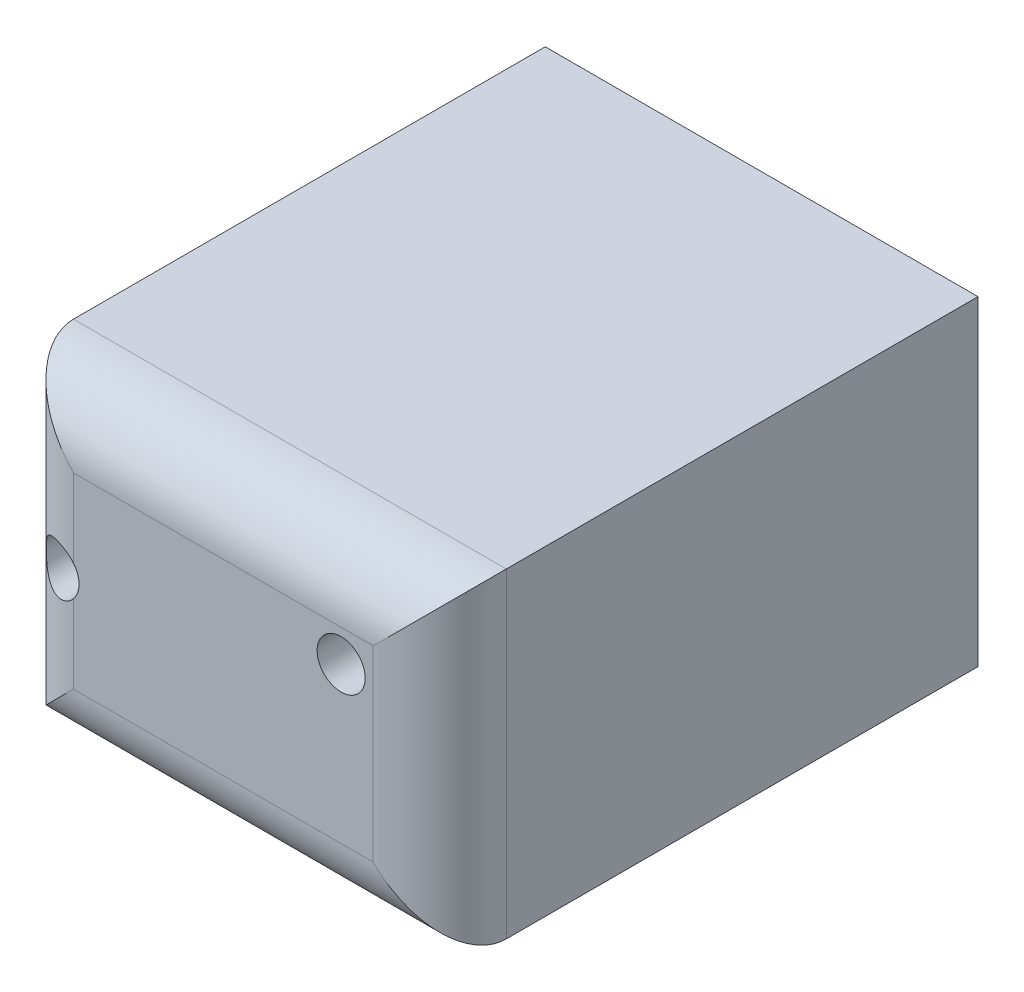
ISO-10303-21;
HEADER;
FILE_DESCRIPTION(('STEP AP214'),'2;1');
FILE_NAME('part.step','',(''),(''),'','','');
FILE_SCHEMA(('AUTOMOTIVE_DESIGN { 1 0 10303 214 1 1 1 1 }'));
ENDSEC;
DATA;
#1=APPLICATION_CONTEXT('core data for automotive mechanical design processes');
#2=APPLICATION_PROTOCOL_DEFINITION('international standard','automotive_design',2000,#1);
#3=PRODUCT_CONTEXT('',#1,'mechanical');
#4=PRODUCT('Part','Part','',(#3));
#5=PRODUCT_RELATED_PRODUCT_CATEGORY('part','',(#4));
#6=PRODUCT_DEFINITION_FORMATION('','',#4);
#7=PRODUCT_DEFINITION_CONTEXT('part definition',#1,'design');
#8=PRODUCT_DEFINITION('design','',#6,#7);
#9=PRODUCT_DEFINITION_SHAPE('','',#8);
#10=(LENGTH_UNIT() NAMED_UNIT(*) SI_UNIT(.MILLI.,.METRE.));
#11=(NAMED_UNIT(*) PLANE_ANGLE_UNIT() SI_UNIT($,.RADIAN.));
#12=(NAMED_UNIT(*) SI_UNIT($,.STERADIAN.) SOLID_ANGLE_UNIT());
#13=UNCERTAINTY_MEASURE_WITH_UNIT(LENGTH_MEASURE(1.E-05),#10,'distance_accuracy_value','');
#14=(GEOMETRIC_REPRESENTATION_CONTEXT(3) GLOBAL_UNCERTAINTY_ASSIGNED_CONTEXT((#13)) GLOBAL_UNIT_ASSIGNED_CONTEXT((#10,
#11,#12)) REPRESENTATION_CONTEXT('',''));
#15=CARTESIAN_POINT('',(0.,0.,0.));
#16=DIRECTION('',(0.,0.,1.));
#17=DIRECTION('',(1.,0.,0.));
#18=AXIS2_PLACEMENT_3D('',#15,#16,#17);
#19=CARTESIAN_POINT('',(-67.5347222222222,-50.,168.));
#20=DIRECTION('',(1.,0.,0.));
#21=DIRECTION('',(0.,1.,0.));
#22=AXIS2_PLACEMENT_3D('',#19,#20,#21);
#23=PLANE('',#22);
#24=DIRECTION('',(0.,-1.,0.));
#25=VECTOR('',#24,1.);
#26=CARTESIAN_POINT('',(-67.5347222222222,-50.,0.));
#27=LINE('',#26,#25);
#28=CARTESIAN_POINT('',(-67.5347222222222,50.,0.));
#29=VERTEX_POINT('',#28);
#30=CARTESIAN_POINT('',(-67.5347222222222,-50.,0.));
#31=VERTEX_POINT('',#30);
#32=EDGE_CURVE('E136',#29,#31,#27,.T.);
#33=ORIENTED_EDGE('',*,*,#32,.T.);
#34=DIRECTION('',(0.,0.,-1.));
#35=VECTOR('',#34,1.);
#36=CARTESIAN_POINT('',(-67.5347222222222,-50.,168.));
#37=LINE('',#36,#35);
#38=CARTESIAN_POINT('',(-67.5347222222222,-50.,147.230769230769));
#39=VERTEX_POINT('',#38);
#40=EDGE_CURVE('E152',#39,#31,#37,.T.);
#41=ORIENTED_EDGE('',*,*,#40,.F.);
#42=DIRECTION('',(0.,-1.,0.));
#43=VECTOR('',#42,1.);
#44=CARTESIAN_POINT('',(-67.5347222222222,50.0000000000001,147.230769230769));
#45=LINE('',#44,#43);
#46=CARTESIAN_POINT('',(-67.5347222222222,50.0000000000001,147.230769230769));
#47=VERTEX_POINT('',#46);
#48=EDGE_CURVE('E113',#47,#39,#45,.T.);
#49=ORIENTED_EDGE('',*,*,#48,.F.);
#50=DIRECTION('',(0.,0.,-1.));
#51=VECTOR('',#50,1.);
#52=CARTESIAN_POINT('',(-67.5347222222222,50.,168.));
#53=LINE('',#52,#51);
#54=EDGE_CURVE('E58',#47,#29,#53,.T.);
#55=ORIENTED_EDGE('',*,*,#54,.T.);
#56=EDGE_LOOP('',(#33,#41,#49,#55));
#57=FACE_BOUND('',#56,.T.);
#58=ADVANCED_FACE('F33',(#57),#23,.F.);
#59=CARTESIAN_POINT('',(0.,0.,168.));
#60=DIRECTION('',(0.,0.,1.));
#61=DIRECTION('',(1.,0.,0.));
#62=AXIS2_PLACEMENT_3D('',#59,#60,#61);
#63=PLANE('',#62);
#64=CARTESIAN_POINT('',(36.7654914529914,19.2307692307692,168.));
#65=DIRECTION('',(0.,0.,1.));
#66=DIRECTION('',(1.,0.,0.));
#67=AXIS2_PLACEMENT_3D('',#64,#65,#66);
#68=CIRCLE('',#67,7.5);
#69=CARTESIAN_POINT('',(44.2654914529914,19.2307692307692,168.));
#70=VERTEX_POINT('',#69);
#71=EDGE_CURVE('E329',#70,#70,#68,.T.);
#72=ORIENTED_EDGE('',*,*,#71,.F.);
#73=EDGE_LOOP('',(#72));
#74=FACE_BOUND('',#73,.T.);
#75=CARTESIAN_POINT('',(-52.5347222222223,-2.78530457965901E-12,168.));
#76=DIRECTION('',(0.,0.,1.));
#77=DIRECTION('',(1.,0.,0.));
#78=AXIS2_PLACEMENT_3D('',#75,#76,#77);
#79=CIRCLE('',#78,7.5);
#80=CARTESIAN_POINT('',(-46.7654914529914,-4.79228299784,168.));
#81=VERTEX_POINT('',#80);
#82=CARTESIAN_POINT('',(-46.7654914529914,4.79228299783441,168.));
#83=VERTEX_POINT('',#82);
#84=EDGE_CURVE('E50',#81,#83,#79,.T.);
#85=ORIENTED_EDGE('',*,*,#84,.F.);
#86=DIRECTION('',(0.,-1.,0.));
#87=VECTOR('',#86,1.);
#88=CARTESIAN_POINT('',(-46.7654914529914,50.,168.));
#89=LINE('',#88,#87);
#90=CARTESIAN_POINT('',(-46.7654914529914,-29.2307692307692,168.));
#91=VERTEX_POINT('',#90);
#92=EDGE_CURVE('E101',#81,#91,#89,.T.);
#93=ORIENTED_EDGE('',*,*,#92,.T.);
#94=DIRECTION('',(1.,0.,0.));
#95=VECTOR('',#94,1.);
#96=CARTESIAN_POINT('',(-67.5347222222222,-29.2307692307692,168.));
#97=LINE('',#96,#95);
#98=CARTESIAN_POINT('',(46.7654914529914,-29.2307692307692,168.));
#99=VERTEX_POINT('',#98);
#100=EDGE_CURVE('E123',#91,#99,#97,.T.);
#101=ORIENTED_EDGE('',*,*,#100,.T.);
#102=DIRECTION('',(0.,-1.,0.));
#103=VECTOR('',#102,1.);
#104=CARTESIAN_POINT('',(46.7654914529914,50.,168.));
#105=LINE('',#104,#103);
#106=CARTESIAN_POINT('',(46.7654914529914,29.2307692307692,168.));
#107=VERTEX_POINT('',#106);
#108=EDGE_CURVE('E127',#107,#99,#105,.T.);
#109=ORIENTED_EDGE('',*,*,#108,.F.);
#110=DIRECTION('',(1.,0.,0.));
#111=VECTOR('',#110,1.);
#112=CARTESIAN_POINT('',(-67.5347222222222,29.2307692307692,168.));
#113=LINE('',#112,#111);
#114=CARTESIAN_POINT('',(-46.7654914529914,29.2307692307692,168.));
#115=VERTEX_POINT('',#114);
#116=EDGE_CURVE('E130',#115,#107,#113,.T.);
#117=ORIENTED_EDGE('',*,*,#116,.F.);
#118=EDGE_CURVE('E104',#115,#83,#89,.T.);
#119=ORIENTED_EDGE('',*,*,#118,.T.);
#120=EDGE_LOOP('',(#85,#93,#101,#109,#117,#119));
#121=FACE_BOUND('',#120,.T.);
#122=ADVANCED_FACE('F100',(#74,#121),#63,.T.);
#123=CARTESIAN_POINT('',(-67.5347222222222,29.2307692307692,147.230769230769));
#124=DIRECTION('',(1.,0.,0.));
#125=DIRECTION('',(0.,0.,-1.));
#126=AXIS2_PLACEMENT_3D('',#123,#124,#125);
#127=CYLINDRICAL_SURFACE('',#126,20.7692307692308);
#128=DIRECTION('',(1.,0.,0.));
#129=VECTOR('',#128,1.);
#130=CARTESIAN_POINT('',(-67.5347222222222,50.,147.230769230769));
#131=LINE('',#130,#129);
#132=CARTESIAN_POINT('',(67.5347222222222,50.,147.230769230769));
#133=VERTEX_POINT('',#132);
#134=EDGE_CURVE('E133',#47,#133,#131,.T.);
#135=ORIENTED_EDGE('',*,*,#134,.F.);
#136=CARTESIAN_POINT('',(-46.7654914529914,29.2307692307692,147.230769230769));
#137=DIRECTION('',(0.707106781186548,0.707106781186547,0.));
#138=DIRECTION('',(0.707106781186547,-0.707106781186548,0.));
#139=AXIS2_PLACEMENT_3D('',#136,#137,#138);
#140=ELLIPSE('',#139,29.3721278339027,20.7692307692308);
#141=EDGE_CURVE('E119',#47,#115,#140,.T.);
#142=ORIENTED_EDGE('',*,*,#141,.T.);
#143=ORIENTED_EDGE('',*,*,#116,.T.);
#144=CARTESIAN_POINT('',(46.7654914529914,29.2307692307692,147.230769230769));
#145=DIRECTION('',(0.707106781186548,-0.707106781186547,0.));
#146=DIRECTION('',(0.707106781186547,0.707106781186548,0.));
#147=AXIS2_PLACEMENT_3D('',#144,#145,#146);
#148=ELLIPSE('',#147,29.3721278339027,20.7692307692308);
#149=EDGE_CURVE('E154',#133,#107,#148,.T.);
#150=ORIENTED_EDGE('',*,*,#149,.F.);
#151=EDGE_LOOP('',(#135,#142,#143,#150));
#152=FACE_BOUND('',#151,.T.);
#153=ADVANCED_FACE('F183',(#152),#127,.T.);
#154=CARTESIAN_POINT('',(-67.5347222222222,-29.2307692307692,147.230769230769));
#155=DIRECTION('',(1.,0.,0.));
#156=DIRECTION('',(0.,0.,-1.));
#157=AXIS2_PLACEMENT_3D('',#154,#155,#156);
#158=CYLINDRICAL_SURFACE('',#157,20.7692307692308);
#159=CARTESIAN_POINT('',(-46.7654914529914,-29.2307692307692,147.230769230769));
#160=DIRECTION('',(0.707106781186547,-0.707106781186548,0.));
#161=DIRECTION('',(0.707106781186548,0.707106781186547,0.));
#162=AXIS2_PLACEMENT_3D('',#159,#160,#161);
#163=ELLIPSE('',#162,29.3721278339027,20.7692307692308);
#164=EDGE_CURVE('E45',#39,#91,#163,.F.);
#165=ORIENTED_EDGE('',*,*,#164,.F.);
#166=DIRECTION('',(1.,0.,0.));
#167=VECTOR('',#166,1.);
#168=CARTESIAN_POINT('',(-67.5347222222222,-50.,147.230769230769));
#169=LINE('',#168,#167);
#170=CARTESIAN_POINT('',(67.5347222222222,-50.,147.230769230769));
#171=VERTEX_POINT('',#170);
#172=EDGE_CURVE('E122',#39,#171,#169,.T.);
#173=ORIENTED_EDGE('',*,*,#172,.T.);
#174=CARTESIAN_POINT('',(46.7654914529914,-29.2307692307692,147.230769230769));
#175=DIRECTION('',(-0.707106781186547,-0.707106781186548,0.));
#176=DIRECTION('',(0.707106781186548,-0.707106781186547,0.));
#177=AXIS2_PLACEMENT_3D('',#174,#175,#176);
#178=ELLIPSE('',#177,29.3721278339027,20.7692307692308);
#179=EDGE_CURVE('E157',#99,#171,#178,.F.);
#180=ORIENTED_EDGE('',*,*,#179,.F.);
#181=ORIENTED_EDGE('',*,*,#100,.F.);
#182=EDGE_LOOP('',(#165,#173,#180,#181));
#183=FACE_BOUND('',#182,.T.);
#184=ADVANCED_FACE('F184',(#183),#158,.T.);
#185=CARTESIAN_POINT('',(67.5347222222222,-50.,168.));
#186=DIRECTION('',(-1.,0.,0.));
#187=DIRECTION('',(0.,0.,1.));
#188=AXIS2_PLACEMENT_3D('',#185,#186,#187);
#189=PLANE('',#188);
#190=DIRECTION('',(0.,1.,0.));
#191=VECTOR('',#190,1.);
#192=CARTESIAN_POINT('',(67.5347222222222,-50.,0.));
#193=LINE('',#192,#191);
#194=CARTESIAN_POINT('',(67.5347222222222,-50.,0.));
#195=VERTEX_POINT('',#194);
#196=CARTESIAN_POINT('',(67.5347222222222,50.,0.));
#197=VERTEX_POINT('',#196);
#198=EDGE_CURVE('E142',#195,#197,#193,.T.);
#199=ORIENTED_EDGE('',*,*,#198,.T.);
#200=DIRECTION('',(0.,0.,-1.));
#201=VECTOR('',#200,1.);
#202=CARTESIAN_POINT('',(67.5347222222222,50.,168.));
#203=LINE('',#202,#201);
#204=EDGE_CURVE('E148',#133,#197,#203,.T.);
#205=ORIENTED_EDGE('',*,*,#204,.F.);
#206=DIRECTION('',(0.,-1.,0.));
#207=VECTOR('',#206,1.);
#208=CARTESIAN_POINT('',(67.5347222222222,50.,147.230769230769));
#209=LINE('',#208,#207);
#210=EDGE_CURVE('E125',#133,#171,#209,.T.);
#211=ORIENTED_EDGE('',*,*,#210,.T.);
#212=DIRECTION('',(0.,0.,-1.));
#213=VECTOR('',#212,1.);
#214=CARTESIAN_POINT('',(67.5347222222222,-50.,168.));
#215=LINE('',#214,#213);
#216=EDGE_CURVE('E150',#171,#195,#215,.T.);
#217=ORIENTED_EDGE('',*,*,#216,.T.);
#218=EDGE_LOOP('',(#199,#205,#211,#217));
#219=FACE_BOUND('',#218,.T.);
#220=ADVANCED_FACE('F168',(#219),#189,.F.);
#221=CARTESIAN_POINT('',(67.5347222222222,-50.,168.));
#222=DIRECTION('',(0.,1.,0.));
#223=DIRECTION('',(-1.,0.,0.));
#224=AXIS2_PLACEMENT_3D('',#221,#222,#223);
#225=PLANE('',#224);
#226=ORIENTED_EDGE('',*,*,#216,.F.);
#227=ORIENTED_EDGE('',*,*,#172,.F.);
#228=ORIENTED_EDGE('',*,*,#40,.T.);
#229=DIRECTION('',(1.,0.,0.));
#230=VECTOR('',#229,1.);
#231=CARTESIAN_POINT('',(67.5347222222222,-50.,0.));
#232=LINE('',#231,#230);
#233=EDGE_CURVE('E139',#31,#195,#232,.T.);
#234=ORIENTED_EDGE('',*,*,#233,.T.);
#235=EDGE_LOOP('',(#226,#227,#228,#234));
#236=FACE_BOUND('',#235,.T.);
#237=ADVANCED_FACE('F171',(#236),#225,.F.);
#238=CARTESIAN_POINT('',(67.5347222222222,50.,168.));
#239=DIRECTION('',(0.,-1.,0.));
#240=DIRECTION('',(0.,0.,-1.));
#241=AXIS2_PLACEMENT_3D('',#238,#239,#240);
#242=PLANE('',#241);
#243=ORIENTED_EDGE('',*,*,#54,.F.);
#244=ORIENTED_EDGE('',*,*,#134,.T.);
#245=ORIENTED_EDGE('',*,*,#204,.T.);
#246=DIRECTION('',(-1.,0.,0.));
#247=VECTOR('',#246,1.);
#248=CARTESIAN_POINT('',(67.5347222222222,50.,0.));
#249=LINE('',#248,#247);
#250=EDGE_CURVE('E145',#197,#29,#249,.T.);
#251=ORIENTED_EDGE('',*,*,#250,.T.);
#252=EDGE_LOOP('',(#243,#244,#245,#251));
#253=FACE_BOUND('',#252,.T.);
#254=ADVANCED_FACE('F180',(#253),#242,.F.);
#255=CARTESIAN_POINT('',(0.,0.,0.));
#256=DIRECTION('',(0.,0.,1.));
#257=DIRECTION('',(1.,0.,0.));
#258=AXIS2_PLACEMENT_3D('',#255,#256,#257);
#259=PLANE('',#258);
#260=CARTESIAN_POINT('',(36.7654914529914,19.2307692307692,0.));
#261=DIRECTION('',(0.,0.,1.));
#262=DIRECTION('',(1.,0.,0.));
#263=AXIS2_PLACEMENT_3D('',#260,#261,#262);
#264=CIRCLE('',#263,4.49999999999996);
#265=CARTESIAN_POINT('',(41.2654914529914,19.2307692307692,0.));
#266=VERTEX_POINT('',#265);
#267=EDGE_CURVE('E106',#266,#266,#264,.T.);
#268=ORIENTED_EDGE('',*,*,#267,.T.);
#269=EDGE_LOOP('',(#268));
#270=FACE_BOUND('',#269,.T.);
#271=CARTESIAN_POINT('',(-52.5347222222223,-2.78530457965901E-12,0.));
#272=DIRECTION('',(0.,0.,1.));
#273=DIRECTION('',(1.,0.,0.));
#274=AXIS2_PLACEMENT_3D('',#271,#272,#273);
#275=CIRCLE('',#274,4.49999999999996);
#276=CARTESIAN_POINT('',(-48.0347222222224,-2.78530457965901E-12,0.));
#277=VERTEX_POINT('',#276);
#278=EDGE_CURVE('E111',#277,#277,#275,.T.);
#279=ORIENTED_EDGE('',*,*,#278,.T.);
#280=EDGE_LOOP('',(#279));
#281=FACE_BOUND('',#280,.T.);
#282=ORIENTED_EDGE('',*,*,#32,.F.);
#283=ORIENTED_EDGE('',*,*,#250,.F.);
#284=ORIENTED_EDGE('',*,*,#198,.F.);
#285=ORIENTED_EDGE('',*,*,#233,.F.);
#286=EDGE_LOOP('',(#282,#283,#284,#285));
#287=FACE_BOUND('',#286,.T.);
#288=ADVANCED_FACE('F178',(#270,#281,#287),#259,.F.);
#289=CARTESIAN_POINT('',(46.7654914529914,50.,147.230769230769));
#290=DIRECTION('',(0.,-1.,0.));
#291=DIRECTION('',(1.,0.,0.));
#292=AXIS2_PLACEMENT_3D('',#289,#290,#291);
#293=CYLINDRICAL_SURFACE('',#292,20.7692307692308);
#294=ORIENTED_EDGE('',*,*,#108,.T.);
#295=ORIENTED_EDGE('',*,*,#179,.T.);
#296=ORIENTED_EDGE('',*,*,#210,.F.);
#297=ORIENTED_EDGE('',*,*,#149,.T.);
#298=EDGE_LOOP('',(#294,#295,#296,#297));
#299=FACE_BOUND('',#298,.T.);
#300=ADVANCED_FACE('F161',(#299),#293,.T.);
#301=CARTESIAN_POINT('',(-46.7654914529914,50.,147.230769230769));
#302=DIRECTION('',(0.,-1.,0.));
#303=DIRECTION('',(1.,0.,0.));
#304=AXIS2_PLACEMENT_3D('',#301,#302,#303);
#305=CYLINDRICAL_SURFACE('',#304,20.7692307692308);
#306=CARTESIAN_POINT('',(-46.7654914529914,4.7922829978344,168.));
#307=CARTESIAN_POINT('',(-46.8960808889132,4.94953159799905,168.00000315268));
#308=CARTESIAN_POINT('',(-47.0331393274406,5.10141713270744,167.998768861195));
#309=CARTESIAN_POINT('',(-47.3191690824698,5.39348616359764,167.99311045447));
#310=CARTESIAN_POINT('',(-47.4681415643609,5.53366851226771,167.988686026841));
#311=CARTESIAN_POINT('',(-47.7769104654192,5.80129128799375,167.97593369407));
#312=CARTESIAN_POINT('',(-47.9367042238686,5.92873482830274,167.967606745514));
#313=CARTESIAN_POINT('',(-48.2659495222436,6.17002637741221,167.946385948705));
#314=CARTESIAN_POINT('',(-48.4354004778457,6.283875207494,167.933492376518));
#315=CARTESIAN_POINT('',(-48.7829181773917,6.49735415144674,167.902523025496));
#316=CARTESIAN_POINT('',(-48.960996726623,6.59696400146326,167.884439969233));
#317=CARTESIAN_POINT('',(-49.3241413488758,6.78112207585621,167.842602192244));
#318=CARTESIAN_POINT('',(-49.5092074527479,6.86567023372502,167.818847446474));
#319=CARTESIAN_POINT('',(-49.8847052375885,7.01915383169213,167.765310597834));
#320=CARTESIAN_POINT('',(-50.0751330692885,7.08810016665296,167.735532728643));
#321=CARTESIAN_POINT('',(-50.4599398692726,7.21013311744659,167.669705001504));
#322=CARTESIAN_POINT('',(-50.6543187675105,7.26322001418156,167.633655254661));
#323=CARTESIAN_POINT('',(-51.0426554936224,7.35274568052284,167.555765307823));
#324=CARTESIAN_POINT('',(-51.2365788300632,7.38941389918455,167.514016292821));
#325=CARTESIAN_POINT('',(-51.6253807792816,7.44726398732745,167.424387916302));
#326=CARTESIAN_POINT('',(-51.8202596911378,7.46844064927394,167.376506499709));
#327=CARTESIAN_POINT('',(-52.2095366818422,7.49548704032459,167.274815523922));
#328=CARTESIAN_POINT('',(-52.4039347307422,7.5013558388992,167.221005604556));
#329=CARTESIAN_POINT('',(-52.7910266834867,7.49811900185965,167.107754886502));
#330=CARTESIAN_POINT('',(-52.9837199105684,7.48900766608244,167.04831195248));
#331=CARTESIAN_POINT('',(-53.3728574572689,7.45566810609546,166.922060495688));
#332=CARTESIAN_POINT('',(-53.569197282712,7.43092234910095,166.855067082798));
#333=CARTESIAN_POINT('',(-53.9576520843938,7.36641393331767,166.716054718324));
#334=CARTESIAN_POINT('',(-54.1497654823677,7.32664576219455,166.64403392991));
#335=CARTESIAN_POINT('',(-54.528653679773,7.2327258422292,166.49565032296));
#336=CARTESIAN_POINT('',(-54.7154298962364,7.17857795127851,166.419288673333));
#337=CARTESIAN_POINT('',(-55.0829081576626,7.05650424865117,166.262884836371));
#338=CARTESIAN_POINT('',(-55.263607988878,6.98857347765748,166.182841332281));
#339=CARTESIAN_POINT('',(-55.6357638406932,6.83214690091417,166.011749316962));
#340=CARTESIAN_POINT('',(-55.826504229448,6.74227827460992,165.920397653131));
#341=CARTESIAN_POINT('',(-56.1989180824004,6.54735572800397,165.735219612202));
#342=CARTESIAN_POINT('',(-56.3805873409927,6.4422948505371,165.641392117499));
#343=CARTESIAN_POINT('',(-56.7341908142879,6.21758688414206,165.452355542716));
#344=CARTESIAN_POINT('',(-56.906115883641,6.09792641430633,165.357145266751));
#345=CARTESIAN_POINT('',(-57.2393483473345,5.84468070621285,165.166658052727));
#346=CARTESIAN_POINT('',(-57.4006553798932,5.71109499388924,165.071381112508));
#347=CARTESIAN_POINT('',(-57.7268838501736,5.41702854018611,164.873010176915));
#348=CARTESIAN_POINT('',(-57.8906684053748,5.2551971282219,164.770042767513));
#349=CARTESIAN_POINT('',(-58.2036567536802,4.91593875870728,164.567553002133));
#350=CARTESIAN_POINT('',(-58.3528580202785,4.73850910889209,164.468031245025));
#351=CARTESIAN_POINT('',(-58.6353066121048,4.36885654567168,164.274761751345));
#352=CARTESIAN_POINT('',(-58.7685746091411,4.17665334356689,164.181006611608));
#353=CARTESIAN_POINT('',(-59.0180285445109,3.77783434362629,164.001573847228));
#354=CARTESIAN_POINT('',(-59.1342147546047,3.57121877515912,163.915896094085));
#355=CARTESIAN_POINT('',(-59.3186035505929,3.20296477700713,163.777362651209));
#356=CARTESIAN_POINT('',(-59.3912353991163,3.04449467999663,163.721941963187));
#357=CARTESIAN_POINT('',(-59.525938967631,2.7209520505097,163.61793389703));
#358=CARTESIAN_POINT('',(-59.5880121101764,2.55588041115347,163.569345598534));
#359=CARTESIAN_POINT('',(-59.7008342205356,2.21995564381299,163.480170075072));
#360=CARTESIAN_POINT('',(-59.7515926463433,2.04910748307627,163.439576170911));
#361=CARTESIAN_POINT('',(-59.8411272058869,1.70248836947937,163.367435765898));
#362=CARTESIAN_POINT('',(-59.879908263711,1.52671947211364,163.335885547426));
#363=CARTESIAN_POINT('',(-59.9451288560141,1.17003534507825,163.282557308147));
#364=CARTESIAN_POINT('',(-59.9714736230623,0.9890914001455,163.260854373001));
#365=CARTESIAN_POINT('',(-60.0108980196627,0.62478665563819,163.228294378594));
#366=CARTESIAN_POINT('',(-60.0239777810569,0.441425880103066,163.217437211536));
#367=CARTESIAN_POINT('',(-60.0366101586191,0.0739542774298869,163.206952245149));
#368=CARTESIAN_POINT('',(-60.0361656011902,-0.110156384950158,163.207322099523));
#369=CARTESIAN_POINT('',(-60.0217641933137,-0.477471823713444,163.219273467871));
#370=CARTESIAN_POINT('',(-60.0078082277583,-0.660676658631572,163.230854247616));
#371=CARTESIAN_POINT('',(-59.9688944503422,-1.00486854144872,163.262975803758));
#372=CARTESIAN_POINT('',(-59.945289812551,-1.16611549069352,163.282412029619));
#373=CARTESIAN_POINT('',(-59.8879004095884,-1.48564064733844,163.329362469792));
#374=CARTESIAN_POINT('',(-59.8541122788101,-1.64391785485104,163.356879354655));
#375=CARTESIAN_POINT('',(-59.7768067670728,-1.95656231215609,163.419317088778));
#376=CARTESIAN_POINT('',(-59.7332903496282,-2.11092994747806,163.454237204785));
#377=CARTESIAN_POINT('',(-59.6370302861376,-2.41509923786357,163.530714556623));
#378=CARTESIAN_POINT('',(-59.5842830144274,-2.56489907155254,163.572274399823));
#379=CARTESIAN_POINT('',(-59.4043240753801,-3.02882747442479,163.712427387723));
#380=CARTESIAN_POINT('',(-59.2612461523055,-3.33378714811352,163.821638092807));
#381=CARTESIAN_POINT('',(-58.9397822321033,-3.91614413170211,164.058946481981));
#382=CARTESIAN_POINT('',(-58.761378541301,-4.19352752442001,164.187053622524));
#383=CARTESIAN_POINT('',(-58.3317738853729,-4.77504030804815,164.483699352187));
#384=CARTESIAN_POINT('',(-58.0731597639,-5.07232094323092,164.655043757479));
#385=CARTESIAN_POINT('',(-57.6549828766499,-5.4837282165968,164.917126423141));
#386=CARTESIAN_POINT('',(-57.5104324338178,-5.61519426754266,165.005397339879));
#387=CARTESIAN_POINT('',(-57.2116959534962,-5.86634276773786,165.18258986982));
#388=CARTESIAN_POINT('',(-57.0575084448774,-5.98602341068952,165.27151158053));
#389=CARTESIAN_POINT('',(-56.7143803096488,-6.23152405514655,165.463300609581));
#390=CARTESIAN_POINT('',(-56.5238571618265,-6.35519561622979,165.566092490296));
#391=CARTESIAN_POINT('',(-56.1315954252806,-6.5851475194449,165.769535063791));
#392=CARTESIAN_POINT('',(-55.9298603009821,-6.69143319411046,165.870186404837));
#393=CARTESIAN_POINT('',(-55.5160447850357,-6.88578116387597,166.068002792233));
#394=CARTESIAN_POINT('',(-55.3039609516973,-6.97383734460695,166.165166659842));
#395=CARTESIAN_POINT('',(-54.8706844865604,-7.13066274628963,166.35464665087));
#396=CARTESIAN_POINT('',(-54.6494923561779,-7.1994330273154,166.44696304051));
#397=CARTESIAN_POINT('',(-54.2017933962389,-7.31599609640034,166.624575609375));
#398=CARTESIAN_POINT('',(-53.9753688763661,-7.36400569934464,166.709936394819));
#399=CARTESIAN_POINT('',(-53.5165659180913,-7.43908656221607,166.873662459157));
#400=CARTESIAN_POINT('',(-53.2841873820976,-7.46615747871277,166.952027623292));
#401=CARTESIAN_POINT('',(-52.8155922588159,-7.49841433033938,167.100786842786));
#402=CARTESIAN_POINT('',(-52.5793790876558,-7.50361877534037,167.171187590839));
#403=CARTESIAN_POINT('',(-52.105136311042,-7.49144139915292,167.303379997772));
#404=CARTESIAN_POINT('',(-51.8671069658736,-7.47406275618802,167.365172866724));
#405=CARTESIAN_POINT('',(-51.4184702000909,-7.41951107910116,167.473245458251));
#406=CARTESIAN_POINT('',(-51.2077940622244,-7.38478820570426,167.520488569582));
#407=CARTESIAN_POINT('',(-50.7887540641832,-7.29708184619869,167.607719198454));
#408=CARTESIAN_POINT('',(-50.5803900373384,-7.24409968526512,167.647707242213));
#409=CARTESIAN_POINT('',(-50.1678414009633,-7.11999159044665,167.720494621134));
#410=CARTESIAN_POINT('',(-49.9636569767361,-7.04886485399416,167.753293638193));
#411=CARTESIAN_POINT('',(-49.5613602182032,-6.88882959222363,167.811959253145));
#412=CARTESIAN_POINT('',(-49.3632474768283,-6.79992226200635,167.837826316688));
#413=CARTESIAN_POINT('',(-48.9887669661103,-6.61187749503254,167.881458488922));
#414=CARTESIAN_POINT('',(-48.8118560635746,-6.51392193327924,167.899669861454));
#415=CARTESIAN_POINT('',(-48.4662064354722,-6.30381450423434,167.930977624926));
#416=CARTESIAN_POINT('',(-48.2974673770242,-6.19166321588136,167.944074224372));
#417=CARTESIAN_POINT('',(-47.9696542750649,-5.95408145078525,167.965713075484));
#418=CARTESIAN_POINT('',(-47.8105678837337,-5.8286685272528,167.97426125922));
#419=CARTESIAN_POINT('',(-47.5030330231206,-5.5653437990121,167.987470696489));
#420=CARTESIAN_POINT('',(-47.3545794897998,-5.42743801603021,167.992133811742));
#421=CARTESIAN_POINT('',(-47.1339060945187,-5.20513886852477,167.996879108717));
#422=CARTESIAN_POINT('',(-47.0575992385793,-5.12478286724795,167.998079434846));
#423=CARTESIAN_POINT('',(-46.908737398396,-4.96089990847551,167.999639089312));
#424=CARTESIAN_POINT('',(-46.8361764726159,-4.87737836129624,167.999999792152));
#425=CARTESIAN_POINT('',(-46.7654914529914,-4.79228299783996,168.));
#426=B_SPLINE_CURVE_WITH_KNOTS('',3,(#306,#307,#308,#309,#310,#311,#312,#313,#314,#315,#316,
#317,#318,#319,#320,#321,#322,#323,#324,#325,#326,#327,#328,#329,#330,#331,#332,#333,#334,#335,
#336,#337,#338,#339,#340,#341,#342,#343,#344,#345,#346,#347,#348,#349,#350,#351,#352,#353,#354,
#355,#356,#357,#358,#359,#360,#361,#362,#363,#364,#365,#366,#367,#368,#369,#370,#371,#372,#373,
#374,#375,#376,#377,#378,#379,#380,#381,#382,#383,#384,#385,#386,#387,#388,#389,#390,#391,#392,
#393,#394,#395,#396,#397,#398,#399,#400,#401,#402,#403,#404,#405,#406,#407,#408,#409,#410,#411,
#412,#413,#414,#415,#416,#417,#418,#419,#420,#421,#422,#423,#424,#425),.UNSPECIFIED.,.F.,.F.,(4,
2,2,2,2,2,2,2,2,2,2,2,2,2,2,2,2,2,2,2,2,2,2,2,2,2,2,2,2,2,2,2,2,2,2,2,2,2,2,2,2,2,2,2,2,2,2,2,2,
2,2,2,2,2,2,2,2,2,2,4),(0.,0.613046996801196,1.22615403318709,1.83911086334827,2.45203064491204,
3.06581418479459,3.67960043488148,4.29295674190008,4.90630218451546,5.51078607210644,
6.11547306556975,6.72019681569823,7.32515072543271,7.95126143833095,8.57760212022271,
9.20377493253333,9.83017345342171,10.5188214912162,11.2077858942722,11.897386562785,
12.587010715483,13.3427696690952,14.0986593242065,14.8535573947037,15.6084434539572,
16.15670995041,16.7049025213696,17.252635124271,17.8001422448382,18.3517567097962,
18.9033656921573,19.4548593963518,20.0063169844419,20.4981309133082,20.990107563436,
21.4820355085107,21.9741571068539,23.0323186412851,24.0910115256078,25.3747543002088,
26.0175562599286,26.6604565862408,27.4075484710953,28.1544107793243,28.9015231888119,
29.6485945242608,30.3876634169496,31.1267444313813,31.8651996908082,32.6035510352291,
33.2587337278709,33.9138688803765,34.5690330157279,35.2241531298182,35.8325491366642,
36.4409203395296,37.0484961444298,37.6557806322416,37.9881440478594,38.3199629852927),.UNSPECIFIED.);
#427=EDGE_CURVE('E11',#83,#81,#426,.T.);
#428=ORIENTED_EDGE('',*,*,#427,.F.);
#429=ORIENTED_EDGE('',*,*,#118,.F.);
#430=ORIENTED_EDGE('',*,*,#141,.F.);
#431=ORIENTED_EDGE('',*,*,#48,.T.);
#432=ORIENTED_EDGE('',*,*,#164,.T.);
#433=ORIENTED_EDGE('',*,*,#92,.F.);
#434=EDGE_LOOP('',(#428,#429,#430,#431,#432,#433));
#435=FACE_BOUND('',#434,.T.);
#436=ADVANCED_FACE('F108',(#435),#305,.T.);
#437=CARTESIAN_POINT('',(-52.5347222222223,-2.78530457965901E-12,168.));
#438=DIRECTION('',(0.,0.,1.));
#439=DIRECTION('',(1.,0.,0.));
#440=AXIS2_PLACEMENT_3D('',#437,#438,#439);
#441=CYLINDRICAL_SURFACE('',#440,4.49999999999996);
#442=ORIENTED_EDGE('',*,*,#278,.F.);
#443=EDGE_LOOP('',(#442));
#444=FACE_BOUND('',#443,.T.);
#445=CARTESIAN_POINT('',(-52.5347222222223,-2.78530457965901E-12,7.00000000000001));
#446=DIRECTION('',(0.,0.,1.));
#447=DIRECTION('',(1.,0.,0.));
#448=AXIS2_PLACEMENT_3D('',#445,#446,#447);
#449=CIRCLE('',#448,4.49999999999996);
#450=CARTESIAN_POINT('',(-48.0347222222223,-2.78530457965901E-12,7.00000000000001));
#451=VERTEX_POINT('',#450);
#452=EDGE_CURVE('E115',#451,#451,#449,.T.);
#453=ORIENTED_EDGE('',*,*,#452,.T.);
#454=EDGE_LOOP('',(#453));
#455=FACE_BOUND('',#454,.T.);
#456=ADVANCED_FACE('F233',(#444,#455),#441,.F.);
#457=CARTESIAN_POINT('',(-48.0347222222223,-2.78530457965901E-12,7.00000000000001));
#458=DIRECTION('',(0.,0.,-1.));
#459=DIRECTION('',(-1.,0.,0.));
#460=AXIS2_PLACEMENT_3D('',#457,#458,#459);
#461=PLANE('',#460);
#462=ORIENTED_EDGE('',*,*,#452,.F.);
#463=EDGE_LOOP('',(#462));
#464=FACE_BOUND('',#463,.T.);
#465=CARTESIAN_POINT('',(-52.5347222222223,-2.78530457965901E-12,7.00000000000001));
#466=DIRECTION('',(0.,0.,1.));
#467=DIRECTION('',(1.,0.,0.));
#468=AXIS2_PLACEMENT_3D('',#465,#466,#467);
#469=CIRCLE('',#468,7.49999999999997);
#470=CARTESIAN_POINT('',(-45.0347222222223,-2.78530457965901E-12,7.00000000000001));
#471=VERTEX_POINT('',#470);
#472=EDGE_CURVE('E105',#471,#471,#469,.T.);
#473=ORIENTED_EDGE('',*,*,#472,.T.);
#474=EDGE_LOOP('',(#473));
#475=FACE_BOUND('',#474,.T.);
#476=ADVANCED_FACE('F239',(#464,#475),#461,.F.);
#477=CARTESIAN_POINT('',(-52.5347222222223,-2.78530457965901E-12,168.));
#478=DIRECTION('',(0.,0.,1.));
#479=DIRECTION('',(1.,0.,0.));
#480=AXIS2_PLACEMENT_3D('',#477,#478,#479);
#481=CYLINDRICAL_SURFACE('',#480,7.49999999999998);
#482=ORIENTED_EDGE('',*,*,#427,.T.);
#483=ORIENTED_EDGE('',*,*,#84,.T.);
#484=EDGE_LOOP('',(#482,#483));
#485=FACE_BOUND('',#484,.T.);
#486=ORIENTED_EDGE('',*,*,#472,.F.);
#487=EDGE_LOOP('',(#486));
#488=FACE_BOUND('',#487,.T.);
#489=ADVANCED_FACE('F94',(#485,#488),#481,.F.);
#490=CARTESIAN_POINT('',(36.7654914529914,19.2307692307692,168.));
#491=DIRECTION('',(0.,0.,1.));
#492=DIRECTION('',(1.,0.,0.));
#493=AXIS2_PLACEMENT_3D('',#490,#491,#492);
#494=CYLINDRICAL_SURFACE('',#493,4.49999999999996);
#495=ORIENTED_EDGE('',*,*,#267,.F.);
#496=EDGE_LOOP('',(#495));
#497=FACE_BOUND('',#496,.T.);
#498=CARTESIAN_POINT('',(36.7654914529914,19.2307692307692,7.00000000000001));
#499=DIRECTION('',(0.,0.,1.));
#500=DIRECTION('',(1.,0.,0.));
#501=AXIS2_PLACEMENT_3D('',#498,#499,#500);
#502=CIRCLE('',#501,4.49999999999996);
#503=CARTESIAN_POINT('',(41.2654914529914,19.2307692307692,7.00000000000001));
#504=VERTEX_POINT('',#503);
#505=EDGE_CURVE('E331',#504,#504,#502,.T.);
#506=ORIENTED_EDGE('',*,*,#505,.T.);
#507=EDGE_LOOP('',(#506));
#508=FACE_BOUND('',#507,.T.);
#509=ADVANCED_FACE('F254',(#497,#508),#494,.F.);
#510=CARTESIAN_POINT('',(41.2654914529914,19.2307692307692,7.00000000000001));
#511=DIRECTION('',(0.,0.,-1.));
#512=DIRECTION('',(-1.,0.,0.));
#513=AXIS2_PLACEMENT_3D('',#510,#511,#512);
#514=PLANE('',#513);
#515=ORIENTED_EDGE('',*,*,#505,.F.);
#516=EDGE_LOOP('',(#515));
#517=FACE_BOUND('',#516,.T.);
#518=CARTESIAN_POINT('',(36.7654914529914,19.2307692307692,7.00000000000001));
#519=DIRECTION('',(0.,0.,1.));
#520=DIRECTION('',(1.,0.,0.));
#521=AXIS2_PLACEMENT_3D('',#518,#519,#520);
#522=CIRCLE('',#521,7.49999999999997);
#523=CARTESIAN_POINT('',(44.2654914529914,19.2307692307692,7.00000000000001));
#524=VERTEX_POINT('',#523);
#525=EDGE_CURVE('E327',#524,#524,#522,.T.);
#526=ORIENTED_EDGE('',*,*,#525,.T.);
#527=EDGE_LOOP('',(#526));
#528=FACE_BOUND('',#527,.T.);
#529=ADVANCED_FACE('F259',(#517,#528),#514,.F.);
#530=CARTESIAN_POINT('',(36.7654914529914,19.2307692307692,168.));
#531=DIRECTION('',(0.,0.,1.));
#532=DIRECTION('',(1.,0.,0.));
#533=AXIS2_PLACEMENT_3D('',#530,#531,#532);
#534=CYLINDRICAL_SURFACE('',#533,7.49999999999999);
#535=ORIENTED_EDGE('',*,*,#525,.F.);
#536=EDGE_LOOP('',(#535));
#537=FACE_BOUND('',#536,.T.);
#538=ORIENTED_EDGE('',*,*,#71,.T.);
#539=EDGE_LOOP('',(#538));
#540=FACE_BOUND('',#539,.T.);
#541=ADVANCED_FACE('F267',(#537,#540),#534,.F.);
#542=CLOSED_SHELL('',(#58,#122,#153,#184,#220,#237,#254,#288,#300,#436,#456,#476,#489,#509,#529,#541));
#543=MANIFOLD_SOLID_BREP('B2',#542);
#544=ADVANCED_BREP_SHAPE_REPRESENTATION('',(#18,#543),#14);
#545=SHAPE_DEFINITION_REPRESENTATION(#9,#544);
ENDSEC;
END-ISO-10303-21;
